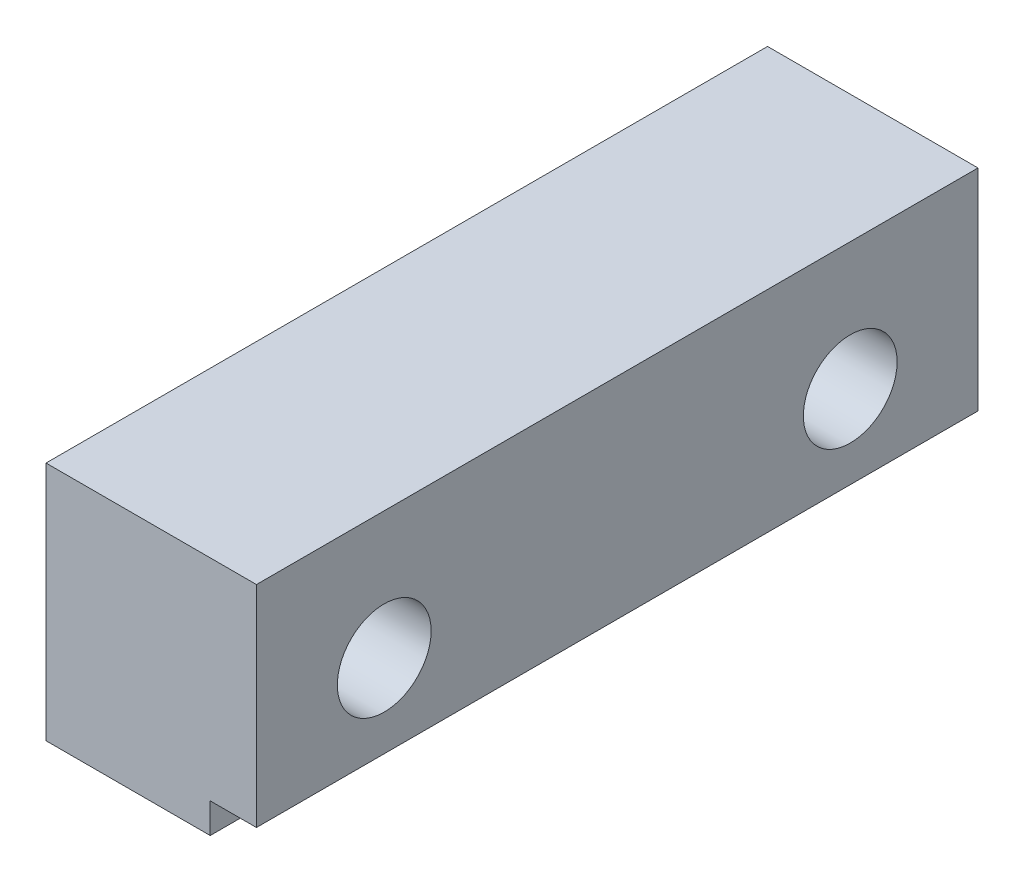
ISO-10303-21;
HEADER;
FILE_DESCRIPTION(('STEP AP214'),'2;1');
FILE_NAME('part.step','',(''),(''),'','','');
FILE_SCHEMA(('AUTOMOTIVE_DESIGN { 1 0 10303 214 1 1 1 1 }'));
ENDSEC;
DATA;
#1=APPLICATION_CONTEXT('core data for automotive mechanical design processes');
#2=APPLICATION_PROTOCOL_DEFINITION('international standard','automotive_design',2000,#1);
#3=PRODUCT_CONTEXT('',#1,'mechanical');
#4=PRODUCT('Part','Part','',(#3));
#5=PRODUCT_RELATED_PRODUCT_CATEGORY('part','',(#4));
#6=PRODUCT_DEFINITION_FORMATION('','',#4);
#7=PRODUCT_DEFINITION_CONTEXT('part definition',#1,'design');
#8=PRODUCT_DEFINITION('design','',#6,#7);
#9=PRODUCT_DEFINITION_SHAPE('','',#8);
#10=(LENGTH_UNIT() NAMED_UNIT(*) SI_UNIT(.MILLI.,.METRE.));
#11=(NAMED_UNIT(*) PLANE_ANGLE_UNIT() SI_UNIT($,.RADIAN.));
#12=(NAMED_UNIT(*) SI_UNIT($,.STERADIAN.) SOLID_ANGLE_UNIT());
#13=UNCERTAINTY_MEASURE_WITH_UNIT(LENGTH_MEASURE(1.E-05),#10,'distance_accuracy_value','');
#14=(GEOMETRIC_REPRESENTATION_CONTEXT(3) GLOBAL_UNCERTAINTY_ASSIGNED_CONTEXT((#13)) GLOBAL_UNIT_ASSIGNED_CONTEXT((#10,
#11,#12)) REPRESENTATION_CONTEXT('',''));
#15=CARTESIAN_POINT('',(0.,0.,0.));
#16=DIRECTION('',(0.,0.,1.));
#17=DIRECTION('',(1.,0.,0.));
#18=AXIS2_PLACEMENT_3D('',#15,#16,#17);
#19=CARTESIAN_POINT('',(-22.226,-1.52399999999999,-49.2125));
#20=DIRECTION('',(1.,0.,0.));
#21=DIRECTION('',(0.,0.,-1.));
#22=AXIS2_PLACEMENT_3D('',#19,#20,#21);
#23=CYLINDRICAL_SURFACE('',#22,6.731);
#24=CARTESIAN_POINT('',(-22.225,-1.52399999999999,-49.2125));
#25=DIRECTION('',(1.,0.,0.));
#26=DIRECTION('',(0.,0.,-1.));
#27=AXIS2_PLACEMENT_3D('',#24,#25,#26);
#28=CIRCLE('',#27,6.731);
#29=CARTESIAN_POINT('',(-22.225,-1.52399999999999,-55.9435));
#30=VERTEX_POINT('',#29);
#31=EDGE_CURVE('E144',#30,#30,#28,.F.);
#32=ORIENTED_EDGE('',*,*,#31,.T.);
#33=EDGE_LOOP('',(#32));
#34=FACE_BOUND('',#33,.T.);
#35=CARTESIAN_POINT('',(-16.383,-1.52399999999999,-49.2125));
#36=DIRECTION('',(1.,0.,0.));
#37=DIRECTION('',(0.,0.,-1.));
#38=AXIS2_PLACEMENT_3D('',#35,#36,#37);
#39=CIRCLE('',#38,6.731);
#40=CARTESIAN_POINT('',(-16.383,-1.52399999999999,-55.9435));
#41=VERTEX_POINT('',#40);
#42=EDGE_CURVE('E47',#41,#41,#39,.F.);
#43=ORIENTED_EDGE('',*,*,#42,.F.);
#44=EDGE_LOOP('',(#43));
#45=FACE_BOUND('',#44,.T.);
#46=ADVANCED_FACE('F43',(#34,#45),#23,.F.);
#47=CARTESIAN_POINT('',(-22.226,-1.52399999999999,49.2125));
#48=DIRECTION('',(1.,0.,0.));
#49=DIRECTION('',(0.,0.,-1.));
#50=AXIS2_PLACEMENT_3D('',#47,#48,#49);
#51=CYLINDRICAL_SURFACE('',#50,6.731);
#52=CARTESIAN_POINT('',(-22.225,-1.52399999999999,49.2125));
#53=DIRECTION('',(1.,0.,0.));
#54=DIRECTION('',(0.,0.,-1.));
#55=AXIS2_PLACEMENT_3D('',#52,#53,#54);
#56=CIRCLE('',#55,6.731);
#57=CARTESIAN_POINT('',(-22.225,-1.52399999999999,42.4815));
#58=VERTEX_POINT('',#57);
#59=EDGE_CURVE('E160',#58,#58,#56,.F.);
#60=ORIENTED_EDGE('',*,*,#59,.T.);
#61=EDGE_LOOP('',(#60));
#62=FACE_BOUND('',#61,.T.);
#63=CARTESIAN_POINT('',(-16.383,-1.52399999999999,49.2125));
#64=DIRECTION('',(1.,0.,0.));
#65=DIRECTION('',(0.,0.,-1.));
#66=AXIS2_PLACEMENT_3D('',#63,#64,#65);
#67=CIRCLE('',#66,6.731);
#68=CARTESIAN_POINT('',(-16.383,-1.52399999999999,42.4815));
#69=VERTEX_POINT('',#68);
#70=EDGE_CURVE('E138',#69,#69,#67,.F.);
#71=ORIENTED_EDGE('',*,*,#70,.F.);
#72=EDGE_LOOP('',(#71));
#73=FACE_BOUND('',#72,.T.);
#74=ADVANCED_FACE('F182',(#62,#73),#51,.F.);
#75=CARTESIAN_POINT('',(-22.225,-25.4,76.2));
#76=DIRECTION('',(1.,0.,0.));
#77=DIRECTION('',(0.,0.,-1.));
#78=AXIS2_PLACEMENT_3D('',#75,#76,#77);
#79=PLANE('',#78);
#80=ORIENTED_EDGE('',*,*,#59,.F.);
#81=EDGE_LOOP('',(#80));
#82=FACE_BOUND('',#81,.T.);
#83=ORIENTED_EDGE('',*,*,#31,.F.);
#84=EDGE_LOOP('',(#83));
#85=FACE_BOUND('',#84,.T.);
#86=DIRECTION('',(0.,-1.,0.));
#87=VECTOR('',#86,1.);
#88=CARTESIAN_POINT('',(-22.225,-25.4,-76.2));
#89=LINE('',#88,#87);
#90=CARTESIAN_POINT('',(-22.225,25.4,-76.2));
#91=VERTEX_POINT('',#90);
#92=CARTESIAN_POINT('',(-22.225,-25.4,-76.2));
#93=VERTEX_POINT('',#92);
#94=EDGE_CURVE('E132',#91,#93,#89,.T.);
#95=ORIENTED_EDGE('',*,*,#94,.T.);
#96=DIRECTION('',(0.,0.,-1.));
#97=VECTOR('',#96,1.);
#98=CARTESIAN_POINT('',(-22.225,-25.4,76.2));
#99=LINE('',#98,#97);
#100=CARTESIAN_POINT('',(-22.225,-25.4,76.2));
#101=VERTEX_POINT('',#100);
#102=EDGE_CURVE('E12',#101,#93,#99,.T.);
#103=ORIENTED_EDGE('',*,*,#102,.F.);
#104=DIRECTION('',(0.,-1.,0.));
#105=VECTOR('',#104,1.);
#106=CARTESIAN_POINT('',(-22.225,-25.4,76.2));
#107=LINE('',#106,#105);
#108=CARTESIAN_POINT('',(-22.225,25.4,76.2));
#109=VERTEX_POINT('',#108);
#110=EDGE_CURVE('E129',#109,#101,#107,.T.);
#111=ORIENTED_EDGE('',*,*,#110,.F.);
#112=DIRECTION('',(0.,0.,-1.));
#113=VECTOR('',#112,1.);
#114=CARTESIAN_POINT('',(-22.225,25.4,76.2));
#115=LINE('',#114,#113);
#116=EDGE_CURVE('E136',#109,#91,#115,.T.);
#117=ORIENTED_EDGE('',*,*,#116,.T.);
#118=EDGE_LOOP('',(#95,#103,#111,#117));
#119=FACE_BOUND('',#118,.T.);
#120=ADVANCED_FACE('F45',(#82,#85,#119),#79,.F.);
#121=CARTESIAN_POINT('',(22.225,-25.4,76.2));
#122=DIRECTION('',(0.,1.,0.));
#123=DIRECTION('',(-1.,0.,0.));
#124=AXIS2_PLACEMENT_3D('',#121,#122,#123);
#125=PLANE('',#124);
#126=DIRECTION('',(1.,0.,0.));
#127=VECTOR('',#126,1.);
#128=CARTESIAN_POINT('',(22.225,-25.4,-76.2));
#129=LINE('',#128,#127);
#130=CARTESIAN_POINT('',(12.4600050317555,-25.4,-76.2));
#131=VERTEX_POINT('',#130);
#132=EDGE_CURVE('E127',#93,#131,#129,.T.);
#133=ORIENTED_EDGE('',*,*,#132,.T.);
#134=DIRECTION('',(0.,0.,1.));
#135=VECTOR('',#134,1.);
#136=CARTESIAN_POINT('',(12.4600050317555,-25.4,-76.2));
#137=LINE('',#136,#135);
#138=CARTESIAN_POINT('',(12.4600050317555,-25.4,76.2));
#139=VERTEX_POINT('',#138);
#140=EDGE_CURVE('E159',#131,#139,#137,.T.);
#141=ORIENTED_EDGE('',*,*,#140,.T.);
#142=DIRECTION('',(1.,0.,0.));
#143=VECTOR('',#142,1.);
#144=CARTESIAN_POINT('',(22.225,-25.4,76.2));
#145=LINE('',#144,#143);
#146=EDGE_CURVE('E92',#101,#139,#145,.T.);
#147=ORIENTED_EDGE('',*,*,#146,.F.);
#148=ORIENTED_EDGE('',*,*,#102,.T.);
#149=EDGE_LOOP('',(#133,#141,#147,#148));
#150=FACE_BOUND('',#149,.T.);
#151=ADVANCED_FACE('F172',(#150),#125,.F.);
#152=CARTESIAN_POINT('',(22.225,-25.4,76.2));
#153=DIRECTION('',(-1.,0.,0.));
#154=DIRECTION('',(0.,0.,1.));
#155=AXIS2_PLACEMENT_3D('',#152,#153,#154);
#156=PLANE('',#155);
#157=CARTESIAN_POINT('',(22.225,-1.52399999999999,49.2125));
#158=DIRECTION('',(1.,0.,0.));
#159=DIRECTION('',(0.,0.,-1.));
#160=AXIS2_PLACEMENT_3D('',#157,#158,#159);
#161=CIRCLE('',#160,9.906);
#162=CARTESIAN_POINT('',(22.225,-1.52399999999999,39.3065));
#163=VERTEX_POINT('',#162);
#164=EDGE_CURVE('E146',#163,#163,#161,.T.);
#165=ORIENTED_EDGE('',*,*,#164,.F.);
#166=EDGE_LOOP('',(#165));
#167=FACE_BOUND('',#166,.T.);
#168=CARTESIAN_POINT('',(22.225,-1.52399999999999,-49.2125));
#169=DIRECTION('',(1.,0.,0.));
#170=DIRECTION('',(0.,0.,-1.));
#171=AXIS2_PLACEMENT_3D('',#168,#169,#170);
#172=CIRCLE('',#171,9.906);
#173=CARTESIAN_POINT('',(22.225,-1.52399999999999,-59.1185));
#174=VERTEX_POINT('',#173);
#175=EDGE_CURVE('E151',#174,#174,#172,.T.);
#176=ORIENTED_EDGE('',*,*,#175,.F.);
#177=EDGE_LOOP('',(#176));
#178=FACE_BOUND('',#177,.T.);
#179=DIRECTION('',(0.,1.,0.));
#180=VECTOR('',#179,1.);
#181=CARTESIAN_POINT('',(22.225,-25.4,76.2));
#182=LINE('',#181,#180);
#183=CARTESIAN_POINT('',(22.225,-19.05,76.2));
#184=VERTEX_POINT('',#183);
#185=CARTESIAN_POINT('',(22.225,25.4,76.2));
#186=VERTEX_POINT('',#185);
#187=EDGE_CURVE('E123',#184,#186,#182,.T.);
#188=ORIENTED_EDGE('',*,*,#187,.F.);
#189=DIRECTION('',(0.,0.,1.));
#190=VECTOR('',#189,1.);
#191=CARTESIAN_POINT('',(22.225,-19.05,-76.2));
#192=LINE('',#191,#190);
#193=CARTESIAN_POINT('',(22.225,-19.05,-76.2));
#194=VERTEX_POINT('',#193);
#195=EDGE_CURVE('E111',#194,#184,#192,.T.);
#196=ORIENTED_EDGE('',*,*,#195,.F.);
#197=DIRECTION('',(0.,1.,0.));
#198=VECTOR('',#197,1.);
#199=CARTESIAN_POINT('',(22.225,-25.4,-76.2));
#200=LINE('',#199,#198);
#201=CARTESIAN_POINT('',(22.225,25.4,-76.2));
#202=VERTEX_POINT('',#201);
#203=EDGE_CURVE('E122',#194,#202,#200,.T.);
#204=ORIENTED_EDGE('',*,*,#203,.T.);
#205=DIRECTION('',(0.,0.,-1.));
#206=VECTOR('',#205,1.);
#207=CARTESIAN_POINT('',(22.225,25.4,76.2));
#208=LINE('',#207,#206);
#209=EDGE_CURVE('E52',#186,#202,#208,.T.);
#210=ORIENTED_EDGE('',*,*,#209,.F.);
#211=EDGE_LOOP('',(#188,#196,#204,#210));
#212=FACE_BOUND('',#211,.T.);
#213=ADVANCED_FACE('F120',(#167,#178,#212),#156,.F.);
#214=CARTESIAN_POINT('',(22.225,25.4,76.2));
#215=DIRECTION('',(0.,-1.,0.));
#216=DIRECTION('',(1.,0.,0.));
#217=AXIS2_PLACEMENT_3D('',#214,#215,#216);
#218=PLANE('',#217);
#219=DIRECTION('',(-1.,0.,0.));
#220=VECTOR('',#219,1.);
#221=CARTESIAN_POINT('',(22.225,25.4,-76.2));
#222=LINE('',#221,#220);
#223=EDGE_CURVE('E86',#202,#91,#222,.T.);
#224=ORIENTED_EDGE('',*,*,#223,.T.);
#225=ORIENTED_EDGE('',*,*,#116,.F.);
#226=DIRECTION('',(-1.,0.,0.));
#227=VECTOR('',#226,1.);
#228=CARTESIAN_POINT('',(22.225,25.4,76.2));
#229=LINE('',#228,#227);
#230=EDGE_CURVE('E69',#186,#109,#229,.T.);
#231=ORIENTED_EDGE('',*,*,#230,.F.);
#232=ORIENTED_EDGE('',*,*,#209,.T.);
#233=EDGE_LOOP('',(#224,#225,#231,#232));
#234=FACE_BOUND('',#233,.T.);
#235=ADVANCED_FACE('F178',(#234),#218,.F.);
#236=CARTESIAN_POINT('',(0.,0.,76.2));
#237=DIRECTION('',(0.,0.,1.));
#238=DIRECTION('',(1.,0.,0.));
#239=AXIS2_PLACEMENT_3D('',#236,#237,#238);
#240=PLANE('',#239);
#241=DIRECTION('',(0.,-1.,0.));
#242=VECTOR('',#241,1.);
#243=CARTESIAN_POINT('',(12.4600050317555,-25.4,76.2));
#244=LINE('',#243,#242);
#245=CARTESIAN_POINT('',(12.4600050317555,-19.05,76.2));
#246=VERTEX_POINT('',#245);
#247=EDGE_CURVE('E116',#246,#139,#244,.T.);
#248=ORIENTED_EDGE('',*,*,#247,.F.);
#249=DIRECTION('',(-1.,0.,0.));
#250=VECTOR('',#249,1.);
#251=CARTESIAN_POINT('',(22.225,-19.05,76.2));
#252=LINE('',#251,#250);
#253=EDGE_CURVE('E308',#184,#246,#252,.T.);
#254=ORIENTED_EDGE('',*,*,#253,.F.);
#255=ORIENTED_EDGE('',*,*,#187,.T.);
#256=ORIENTED_EDGE('',*,*,#230,.T.);
#257=ORIENTED_EDGE('',*,*,#110,.T.);
#258=ORIENTED_EDGE('',*,*,#146,.T.);
#259=EDGE_LOOP('',(#248,#254,#255,#256,#257,#258));
#260=FACE_BOUND('',#259,.T.);
#261=ADVANCED_FACE('F195',(#260),#240,.T.);
#262=CARTESIAN_POINT('',(0.,0.,-76.2));
#263=DIRECTION('',(0.,0.,1.));
#264=DIRECTION('',(1.,0.,0.));
#265=AXIS2_PLACEMENT_3D('',#262,#263,#264);
#266=PLANE('',#265);
#267=DIRECTION('',(-1.,0.,0.));
#268=VECTOR('',#267,1.);
#269=CARTESIAN_POINT('',(22.225,-19.05,-76.2));
#270=LINE('',#269,#268);
#271=CARTESIAN_POINT('',(12.4600050317555,-19.05,-76.2));
#272=VERTEX_POINT('',#271);
#273=EDGE_CURVE('E107',#194,#272,#270,.T.);
#274=ORIENTED_EDGE('',*,*,#273,.T.);
#275=DIRECTION('',(0.,-1.,0.));
#276=VECTOR('',#275,1.);
#277=CARTESIAN_POINT('',(12.4600050317555,-25.4,-76.2));
#278=LINE('',#277,#276);
#279=EDGE_CURVE('E60',#272,#131,#278,.T.);
#280=ORIENTED_EDGE('',*,*,#279,.T.);
#281=ORIENTED_EDGE('',*,*,#132,.F.);
#282=ORIENTED_EDGE('',*,*,#94,.F.);
#283=ORIENTED_EDGE('',*,*,#223,.F.);
#284=ORIENTED_EDGE('',*,*,#203,.F.);
#285=EDGE_LOOP('',(#274,#280,#281,#282,#283,#284));
#286=FACE_BOUND('',#285,.T.);
#287=ADVANCED_FACE('F125',(#286),#266,.F.);
#288=CARTESIAN_POINT('',(-16.383,-1.52399999999999,49.2125));
#289=DIRECTION('',(1.,0.,0.));
#290=DIRECTION('',(0.,0.,-1.));
#291=AXIS2_PLACEMENT_3D('',#288,#289,#290);
#292=PLANE('',#291);
#293=CARTESIAN_POINT('',(-16.383,-1.52399999999999,49.2125));
#294=DIRECTION('',(1.,0.,0.));
#295=DIRECTION('',(0.,0.,-1.));
#296=AXIS2_PLACEMENT_3D('',#293,#294,#295);
#297=CIRCLE('',#296,9.906);
#298=CARTESIAN_POINT('',(-16.383,-1.52399999999999,39.3065));
#299=VERTEX_POINT('',#298);
#300=EDGE_CURVE('E140',#299,#299,#297,.T.);
#301=ORIENTED_EDGE('',*,*,#300,.T.);
#302=EDGE_LOOP('',(#301));
#303=FACE_BOUND('',#302,.T.);
#304=ORIENTED_EDGE('',*,*,#70,.T.);
#305=EDGE_LOOP('',(#304));
#306=FACE_BOUND('',#305,.T.);
#307=ADVANCED_FACE('F200',(#303,#306),#292,.T.);
#308=CARTESIAN_POINT('',(-16.383,-1.52399999999999,49.2125));
#309=DIRECTION('',(1.,0.,0.));
#310=DIRECTION('',(0.,0.,-1.));
#311=AXIS2_PLACEMENT_3D('',#308,#309,#310);
#312=CYLINDRICAL_SURFACE('',#311,9.906);
#313=ORIENTED_EDGE('',*,*,#300,.F.);
#314=EDGE_LOOP('',(#313));
#315=FACE_BOUND('',#314,.T.);
#316=ORIENTED_EDGE('',*,*,#164,.T.);
#317=EDGE_LOOP('',(#316));
#318=FACE_BOUND('',#317,.T.);
#319=ADVANCED_FACE('F265',(#315,#318),#312,.F.);
#320=CARTESIAN_POINT('',(-16.383,-1.52399999999999,-49.2125));
#321=DIRECTION('',(1.,0.,0.));
#322=DIRECTION('',(0.,0.,-1.));
#323=AXIS2_PLACEMENT_3D('',#320,#321,#322);
#324=PLANE('',#323);
#325=CARTESIAN_POINT('',(-16.383,-1.52399999999999,-49.2125));
#326=DIRECTION('',(1.,0.,0.));
#327=DIRECTION('',(0.,0.,-1.));
#328=AXIS2_PLACEMENT_3D('',#325,#326,#327);
#329=CIRCLE('',#328,9.906);
#330=CARTESIAN_POINT('',(-16.383,-1.52399999999999,-59.1185));
#331=VERTEX_POINT('',#330);
#332=EDGE_CURVE('E156',#331,#331,#329,.T.);
#333=ORIENTED_EDGE('',*,*,#332,.T.);
#334=EDGE_LOOP('',(#333));
#335=FACE_BOUND('',#334,.T.);
#336=ORIENTED_EDGE('',*,*,#42,.T.);
#337=EDGE_LOOP('',(#336));
#338=FACE_BOUND('',#337,.T.);
#339=ADVANCED_FACE('F256',(#335,#338),#324,.T.);
#340=CARTESIAN_POINT('',(-16.383,-1.52399999999999,-49.2125));
#341=DIRECTION('',(1.,0.,0.));
#342=DIRECTION('',(0.,0.,-1.));
#343=AXIS2_PLACEMENT_3D('',#340,#341,#342);
#344=CYLINDRICAL_SURFACE('',#343,9.906);
#345=ORIENTED_EDGE('',*,*,#332,.F.);
#346=EDGE_LOOP('',(#345));
#347=FACE_BOUND('',#346,.T.);
#348=ORIENTED_EDGE('',*,*,#175,.T.);
#349=EDGE_LOOP('',(#348));
#350=FACE_BOUND('',#349,.T.);
#351=ADVANCED_FACE('F239',(#347,#350),#344,.F.);
#352=CARTESIAN_POINT('',(12.4600050317555,-25.4,-76.2));
#353=DIRECTION('',(-1.,0.,0.));
#354=DIRECTION('',(0.,0.,1.));
#355=AXIS2_PLACEMENT_3D('',#352,#353,#354);
#356=PLANE('',#355);
#357=ORIENTED_EDGE('',*,*,#247,.T.);
#358=ORIENTED_EDGE('',*,*,#140,.F.);
#359=ORIENTED_EDGE('',*,*,#279,.F.);
#360=DIRECTION('',(0.,0.,1.));
#361=VECTOR('',#360,1.);
#362=CARTESIAN_POINT('',(12.4600050317555,-19.05,-76.2));
#363=LINE('',#362,#361);
#364=EDGE_CURVE('E113',#272,#246,#363,.T.);
#365=ORIENTED_EDGE('',*,*,#364,.T.);
#366=EDGE_LOOP('',(#357,#358,#359,#365));
#367=FACE_BOUND('',#366,.T.);
#368=ADVANCED_FACE('F235',(#367),#356,.F.);
#369=CARTESIAN_POINT('',(22.225,-19.05,-76.2));
#370=DIRECTION('',(0.,1.,0.));
#371=DIRECTION('',(0.,0.,1.));
#372=AXIS2_PLACEMENT_3D('',#369,#370,#371);
#373=PLANE('',#372);
#374=ORIENTED_EDGE('',*,*,#253,.T.);
#375=ORIENTED_EDGE('',*,*,#364,.F.);
#376=ORIENTED_EDGE('',*,*,#273,.F.);
#377=ORIENTED_EDGE('',*,*,#195,.T.);
#378=EDGE_LOOP('',(#374,#375,#376,#377));
#379=FACE_BOUND('',#378,.T.);
#380=ADVANCED_FACE('F110',(#379),#373,.F.);
#381=CLOSED_SHELL('',(#46,#74,#120,#151,#213,#235,#261,#287,#307,#319,#339,#351,#368,#380));
#382=MANIFOLD_SOLID_BREP('B2',#381);
#383=ADVANCED_BREP_SHAPE_REPRESENTATION('',(#18,#382),#14);
#384=SHAPE_DEFINITION_REPRESENTATION(#9,#383);
ENDSEC;
END-ISO-10303-21;
